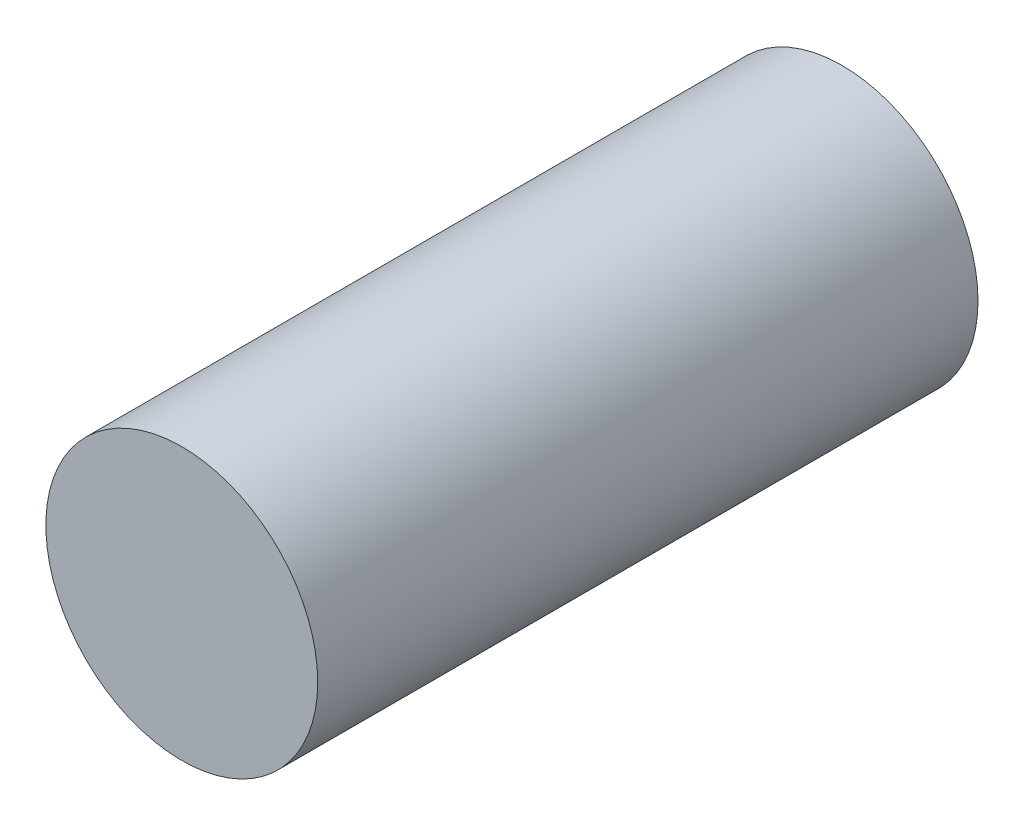
ISO-10303-21;
HEADER;
FILE_DESCRIPTION(('STEP AP214'),'2;1');
FILE_NAME('part.step','',(''),(''),'','','');
FILE_SCHEMA(('AUTOMOTIVE_DESIGN { 1 0 10303 214 1 1 1 1 }'));
ENDSEC;
DATA;
#1=APPLICATION_CONTEXT('core data for automotive mechanical design processes');
#2=APPLICATION_PROTOCOL_DEFINITION('international standard','automotive_design',2000,#1);
#3=PRODUCT_CONTEXT('',#1,'mechanical');
#4=PRODUCT('Part','Part','',(#3));
#5=PRODUCT_RELATED_PRODUCT_CATEGORY('part','',(#4));
#6=PRODUCT_DEFINITION_FORMATION('','',#4);
#7=PRODUCT_DEFINITION_CONTEXT('part definition',#1,'design');
#8=PRODUCT_DEFINITION('design','',#6,#7);
#9=PRODUCT_DEFINITION_SHAPE('','',#8);
#10=(LENGTH_UNIT() NAMED_UNIT(*) SI_UNIT(.MILLI.,.METRE.));
#11=(NAMED_UNIT(*) PLANE_ANGLE_UNIT() SI_UNIT($,.RADIAN.));
#12=(NAMED_UNIT(*) SI_UNIT($,.STERADIAN.) SOLID_ANGLE_UNIT());
#13=UNCERTAINTY_MEASURE_WITH_UNIT(LENGTH_MEASURE(1.E-05),#10,'distance_accuracy_value','');
#14=(GEOMETRIC_REPRESENTATION_CONTEXT(3) GLOBAL_UNCERTAINTY_ASSIGNED_CONTEXT((#13)) GLOBAL_UNIT_ASSIGNED_CONTEXT((#10,
#11,#12)) REPRESENTATION_CONTEXT('',''));
#15=CARTESIAN_POINT('',(0.,0.,0.));
#16=DIRECTION('',(0.,0.,1.));
#17=DIRECTION('',(1.,0.,0.));
#18=AXIS2_PLACEMENT_3D('',#15,#16,#17);
#19=CARTESIAN_POINT('',(0.,0.,17.));
#20=DIRECTION('',(0.,0.,-1.));
#21=DIRECTION('',(-1.,0.,0.));
#22=AXIS2_PLACEMENT_3D('',#19,#20,#21);
#23=CYLINDRICAL_SURFACE('',#22,3.5);
#24=CARTESIAN_POINT('',(0.,0.,17.));
#25=DIRECTION('',(0.,0.,1.));
#26=DIRECTION('',(1.,0.,0.));
#27=AXIS2_PLACEMENT_3D('',#24,#25,#26);
#28=CIRCLE('',#27,3.5);
#29=CARTESIAN_POINT('',(3.5,0.,17.));
#30=VERTEX_POINT('',#29);
#31=EDGE_CURVE('E10',#30,#30,#28,.T.);
#32=ORIENTED_EDGE('',*,*,#31,.F.);
#33=EDGE_LOOP('',(#32));
#34=FACE_BOUND('',#33,.T.);
#35=CARTESIAN_POINT('',(0.,0.,0.));
#36=DIRECTION('',(0.,0.,1.));
#37=DIRECTION('',(1.,0.,0.));
#38=AXIS2_PLACEMENT_3D('',#35,#36,#37);
#39=CIRCLE('',#38,3.5);
#40=CARTESIAN_POINT('',(3.5,0.,0.));
#41=VERTEX_POINT('',#40);
#42=EDGE_CURVE('E40',#41,#41,#39,.T.);
#43=ORIENTED_EDGE('',*,*,#42,.T.);
#44=EDGE_LOOP('',(#43));
#45=FACE_BOUND('',#44,.T.);
#46=ADVANCED_FACE('F37',(#34,#45),#23,.T.);
#47=CARTESIAN_POINT('',(0.,0.,17.));
#48=DIRECTION('',(0.,0.,1.));
#49=DIRECTION('',(1.,0.,0.));
#50=AXIS2_PLACEMENT_3D('',#47,#48,#49);
#51=PLANE('',#50);
#52=ORIENTED_EDGE('',*,*,#31,.T.);
#53=EDGE_LOOP('',(#52));
#54=FACE_BOUND('',#53,.T.);
#55=ADVANCED_FACE('F54',(#54),#51,.T.);
#56=CARTESIAN_POINT('',(0.,0.,0.));
#57=DIRECTION('',(0.,0.,1.));
#58=DIRECTION('',(1.,0.,0.));
#59=AXIS2_PLACEMENT_3D('',#56,#57,#58);
#60=PLANE('',#59);
#61=ORIENTED_EDGE('',*,*,#42,.F.);
#62=EDGE_LOOP('',(#61));
#63=FACE_BOUND('',#62,.T.);
#64=ADVANCED_FACE('F52',(#63),#60,.F.);
#65=CLOSED_SHELL('',(#46,#55,#64));
#66=MANIFOLD_SOLID_BREP('B2',#65);
#67=ADVANCED_BREP_SHAPE_REPRESENTATION('',(#18,#66),#14);
#68=SHAPE_DEFINITION_REPRESENTATION(#9,#67);
ENDSEC;
END-ISO-10303-21;
